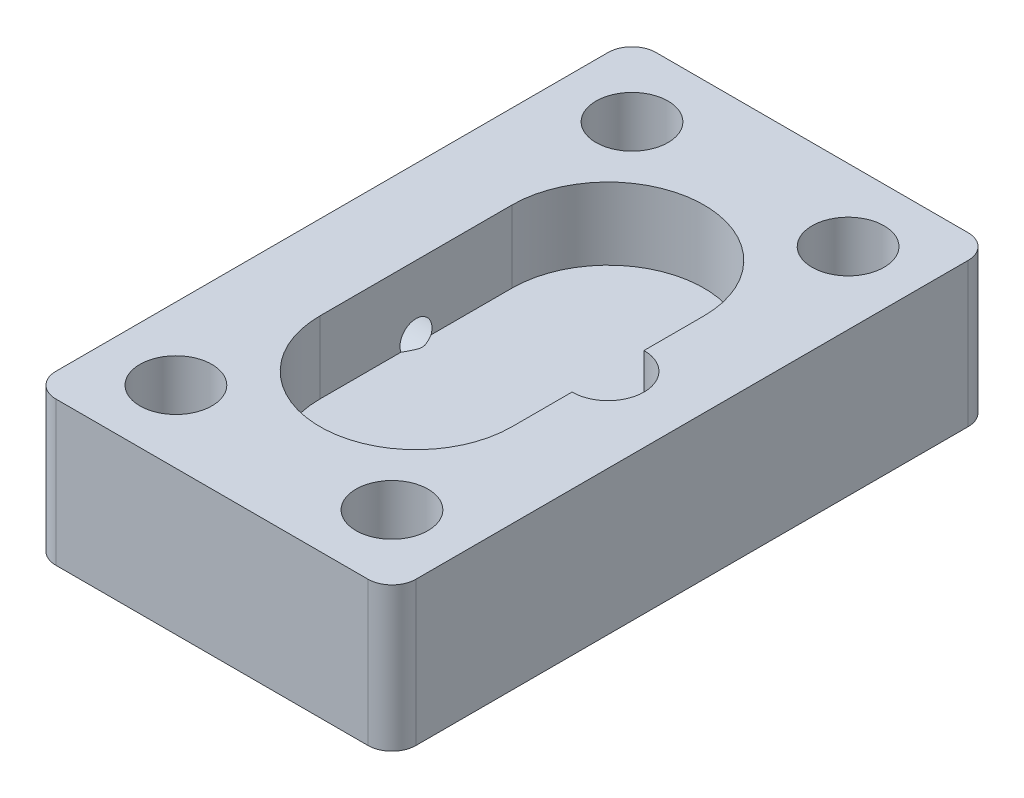
ISO-10303-21;
HEADER;
FILE_DESCRIPTION(('STEP AP214'),'2;1');
FILE_NAME('part.step','',(''),(''),'','','');
FILE_SCHEMA(('AUTOMOTIVE_DESIGN { 1 0 10303 214 1 1 1 1 }'));
ENDSEC;
DATA;
#1=APPLICATION_CONTEXT('core data for automotive mechanical design processes');
#2=APPLICATION_PROTOCOL_DEFINITION('international standard','automotive_design',2000,#1);
#3=PRODUCT_CONTEXT('',#1,'mechanical');
#4=PRODUCT('Part','Part','',(#3));
#5=PRODUCT_RELATED_PRODUCT_CATEGORY('part','',(#4));
#6=PRODUCT_DEFINITION_FORMATION('','',#4);
#7=PRODUCT_DEFINITION_CONTEXT('part definition',#1,'design');
#8=PRODUCT_DEFINITION('design','',#6,#7);
#9=PRODUCT_DEFINITION_SHAPE('','',#8);
#10=(LENGTH_UNIT() NAMED_UNIT(*) SI_UNIT(.MILLI.,.METRE.));
#11=(NAMED_UNIT(*) PLANE_ANGLE_UNIT() SI_UNIT($,.RADIAN.));
#12=(NAMED_UNIT(*) SI_UNIT($,.STERADIAN.) SOLID_ANGLE_UNIT());
#13=UNCERTAINTY_MEASURE_WITH_UNIT(LENGTH_MEASURE(1.E-05),#10,'distance_accuracy_value','');
#14=(GEOMETRIC_REPRESENTATION_CONTEXT(3) GLOBAL_UNCERTAINTY_ASSIGNED_CONTEXT((#13)) GLOBAL_UNIT_ASSIGNED_CONTEXT((#10,
#11,#12)) REPRESENTATION_CONTEXT('',''));
#15=CARTESIAN_POINT('',(0.,0.,0.));
#16=DIRECTION('',(0.,0.,1.));
#17=DIRECTION('',(1.,0.,0.));
#18=AXIS2_PLACEMENT_3D('',#15,#16,#17);
#19=CARTESIAN_POINT('',(-7.5,3.23052308593219,0.));
#20=DIRECTION('',(-1.,0.,0.));
#21=DIRECTION('',(0.,0.,1.));
#22=AXIS2_PLACEMENT_3D('',#19,#20,#21);
#23=CYLINDRICAL_SURFACE('',#22,1.5);
#24=CARTESIAN_POINT('',(-4.5,3.23052308593219,0.));
#25=DIRECTION('',(-1.,0.,0.));
#26=DIRECTION('',(0.,0.,1.));
#27=AXIS2_PLACEMENT_3D('',#24,#25,#26);
#28=CIRCLE('',#27,1.5);
#29=CARTESIAN_POINT('',(-4.5,3.23052308593219,1.5));
#30=VERTEX_POINT('',#29);
#31=EDGE_CURVE('E179',#30,#30,#28,.T.);
#32=ORIENTED_EDGE('',*,*,#31,.F.);
#33=EDGE_LOOP('',(#32));
#34=FACE_BOUND('',#33,.T.);
#35=CARTESIAN_POINT('',(-6.,3.23052308593219,0.));
#36=DIRECTION('',(-1.,0.,0.));
#37=DIRECTION('',(0.,0.,1.));
#38=AXIS2_PLACEMENT_3D('',#35,#36,#37);
#39=CIRCLE('',#38,1.5);
#40=CARTESIAN_POINT('',(-6.,3.23052308593219,1.5));
#41=VERTEX_POINT('',#40);
#42=EDGE_CURVE('E283',#41,#41,#39,.F.);
#43=ORIENTED_EDGE('',*,*,#42,.F.);
#44=EDGE_LOOP('',(#43));
#45=FACE_BOUND('',#44,.T.);
#46=ADVANCED_FACE('F43',(#34,#45),#23,.F.);
#47=CARTESIAN_POINT('',(7.5,6.,12.5));
#48=DIRECTION('',(-1.,0.,0.));
#49=DIRECTION('',(0.,0.,1.));
#50=AXIS2_PLACEMENT_3D('',#47,#48,#49);
#51=PLANE('',#50);
#52=DIRECTION('',(0.,0.,-1.));
#53=VECTOR('',#52,1.);
#54=CARTESIAN_POINT('',(7.5,6.,12.5));
#55=LINE('',#54,#53);
#56=CARTESIAN_POINT('',(7.5,6.,11.5));
#57=VERTEX_POINT('',#56);
#58=CARTESIAN_POINT('',(7.5,6.,-11.5));
#59=VERTEX_POINT('',#58);
#60=EDGE_CURVE('E250',#57,#59,#55,.T.);
#61=ORIENTED_EDGE('',*,*,#60,.F.);
#62=DIRECTION('',(0.,-1.,0.));
#63=VECTOR('',#62,1.);
#64=CARTESIAN_POINT('',(7.5,6.,11.5));
#65=LINE('',#64,#63);
#66=CARTESIAN_POINT('',(7.5,0.,11.5));
#67=VERTEX_POINT('',#66);
#68=EDGE_CURVE('E11',#57,#67,#65,.T.);
#69=ORIENTED_EDGE('',*,*,#68,.T.);
#70=DIRECTION('',(0.,0.,-1.));
#71=VECTOR('',#70,1.);
#72=CARTESIAN_POINT('',(7.5,0.,12.5));
#73=LINE('',#72,#71);
#74=CARTESIAN_POINT('',(7.5,0.,-11.5));
#75=VERTEX_POINT('',#74);
#76=EDGE_CURVE('E235',#67,#75,#73,.T.);
#77=ORIENTED_EDGE('',*,*,#76,.T.);
#78=DIRECTION('',(0.,-1.,0.));
#79=VECTOR('',#78,1.);
#80=CARTESIAN_POINT('',(7.5,6.,-11.5));
#81=LINE('',#80,#79);
#82=EDGE_CURVE('E52',#75,#59,#81,.F.);
#83=ORIENTED_EDGE('',*,*,#82,.T.);
#84=EDGE_LOOP('',(#61,#69,#77,#83));
#85=FACE_BOUND('',#84,.T.);
#86=ADVANCED_FACE('F334',(#85),#51,.F.);
#87=CARTESIAN_POINT('',(-7.5,6.,-12.5));
#88=DIRECTION('',(0.,0.,1.));
#89=DIRECTION('',(1.,0.,0.));
#90=AXIS2_PLACEMENT_3D('',#87,#88,#89);
#91=PLANE('',#90);
#92=DIRECTION('',(-1.,0.,0.));
#93=VECTOR('',#92,1.);
#94=CARTESIAN_POINT('',(-7.5,0.,-12.5));
#95=LINE('',#94,#93);
#96=CARTESIAN_POINT('',(6.5,0.,-12.5));
#97=VERTEX_POINT('',#96);
#98=CARTESIAN_POINT('',(-6.5,0.,-12.5));
#99=VERTEX_POINT('',#98);
#100=EDGE_CURVE('E267',#97,#99,#95,.T.);
#101=ORIENTED_EDGE('',*,*,#100,.T.);
#102=DIRECTION('',(0.,-1.,0.));
#103=VECTOR('',#102,1.);
#104=CARTESIAN_POINT('',(-6.5,6.,-12.5));
#105=LINE('',#104,#103);
#106=CARTESIAN_POINT('',(-6.5,6.,-12.5));
#107=VERTEX_POINT('',#106);
#108=EDGE_CURVE('E444',#99,#107,#105,.F.);
#109=ORIENTED_EDGE('',*,*,#108,.T.);
#110=DIRECTION('',(-1.,0.,0.));
#111=VECTOR('',#110,1.);
#112=CARTESIAN_POINT('',(-7.5,6.,-12.5));
#113=LINE('',#112,#111);
#114=CARTESIAN_POINT('',(6.5,6.,-12.5));
#115=VERTEX_POINT('',#114);
#116=EDGE_CURVE('E254',#115,#107,#113,.T.);
#117=ORIENTED_EDGE('',*,*,#116,.F.);
#118=DIRECTION('',(0.,-1.,0.));
#119=VECTOR('',#118,1.);
#120=CARTESIAN_POINT('',(6.5,6.,-12.5));
#121=LINE('',#120,#119);
#122=EDGE_CURVE('E464',#115,#97,#121,.T.);
#123=ORIENTED_EDGE('',*,*,#122,.T.);
#124=EDGE_LOOP('',(#101,#109,#117,#123));
#125=FACE_BOUND('',#124,.T.);
#126=ADVANCED_FACE('F330',(#125),#91,.F.);
#127=CARTESIAN_POINT('',(-7.5,6.,12.5));
#128=DIRECTION('',(1.,0.,0.));
#129=DIRECTION('',(0.,0.,-1.));
#130=AXIS2_PLACEMENT_3D('',#127,#128,#129);
#131=PLANE('',#130);
#132=CARTESIAN_POINT('',(-7.5,3.23052308593219,0.));
#133=DIRECTION('',(-1.,0.,0.));
#134=DIRECTION('',(0.,0.,1.));
#135=AXIS2_PLACEMENT_3D('',#132,#133,#134);
#136=CIRCLE('',#135,2.5);
#137=CARTESIAN_POINT('',(-7.5,3.23052308593219,2.5));
#138=VERTEX_POINT('',#137);
#139=EDGE_CURVE('E384',#138,#138,#136,.T.);
#140=ORIENTED_EDGE('',*,*,#139,.F.);
#141=EDGE_LOOP('',(#140));
#142=FACE_BOUND('',#141,.T.);
#143=DIRECTION('',(0.,0.,1.));
#144=VECTOR('',#143,1.);
#145=CARTESIAN_POINT('',(-7.5,6.,12.5));
#146=LINE('',#145,#144);
#147=CARTESIAN_POINT('',(-7.5,6.,-11.5));
#148=VERTEX_POINT('',#147);
#149=CARTESIAN_POINT('',(-7.5,6.,11.5));
#150=VERTEX_POINT('',#149);
#151=EDGE_CURVE('E259',#148,#150,#146,.T.);
#152=ORIENTED_EDGE('',*,*,#151,.F.);
#153=DIRECTION('',(0.,-1.,0.));
#154=VECTOR('',#153,1.);
#155=CARTESIAN_POINT('',(-7.5,6.,-11.5));
#156=LINE('',#155,#154);
#157=CARTESIAN_POINT('',(-7.5,0.,-11.5));
#158=VERTEX_POINT('',#157);
#159=EDGE_CURVE('E446',#148,#158,#156,.T.);
#160=ORIENTED_EDGE('',*,*,#159,.T.);
#161=DIRECTION('',(0.,0.,1.));
#162=VECTOR('',#161,1.);
#163=CARTESIAN_POINT('',(-7.5,0.,12.5));
#164=LINE('',#163,#162);
#165=CARTESIAN_POINT('',(-7.5,0.,11.5));
#166=VERTEX_POINT('',#165);
#167=EDGE_CURVE('E271',#158,#166,#164,.T.);
#168=ORIENTED_EDGE('',*,*,#167,.T.);
#169=DIRECTION('',(0.,-1.,0.));
#170=VECTOR('',#169,1.);
#171=CARTESIAN_POINT('',(-7.5,6.,11.5));
#172=LINE('',#171,#170);
#173=EDGE_CURVE('E166',#166,#150,#172,.F.);
#174=ORIENTED_EDGE('',*,*,#173,.T.);
#175=EDGE_LOOP('',(#152,#160,#168,#174));
#176=FACE_BOUND('',#175,.T.);
#177=ADVANCED_FACE('F327',(#142,#176),#131,.F.);
#178=CARTESIAN_POINT('',(-7.5,6.,12.5));
#179=DIRECTION('',(0.,0.,-1.));
#180=DIRECTION('',(-1.,0.,0.));
#181=AXIS2_PLACEMENT_3D('',#178,#179,#180);
#182=PLANE('',#181);
#183=DIRECTION('',(1.,0.,0.));
#184=VECTOR('',#183,1.);
#185=CARTESIAN_POINT('',(-7.5,6.,12.5));
#186=LINE('',#185,#184);
#187=CARTESIAN_POINT('',(-6.5,6.,12.5));
#188=VERTEX_POINT('',#187);
#189=CARTESIAN_POINT('',(6.5,6.,12.5));
#190=VERTEX_POINT('',#189);
#191=EDGE_CURVE('E167',#188,#190,#186,.T.);
#192=ORIENTED_EDGE('',*,*,#191,.F.);
#193=DIRECTION('',(0.,-1.,0.));
#194=VECTOR('',#193,1.);
#195=CARTESIAN_POINT('',(-6.5,6.,12.5));
#196=LINE('',#195,#194);
#197=CARTESIAN_POINT('',(-6.5,0.,12.5));
#198=VERTEX_POINT('',#197);
#199=EDGE_CURVE('E451',#188,#198,#196,.T.);
#200=ORIENTED_EDGE('',*,*,#199,.T.);
#201=DIRECTION('',(1.,0.,0.));
#202=VECTOR('',#201,1.);
#203=CARTESIAN_POINT('',(-7.5,0.,12.5));
#204=LINE('',#203,#202);
#205=CARTESIAN_POINT('',(6.5,0.,12.5));
#206=VERTEX_POINT('',#205);
#207=EDGE_CURVE('E255',#198,#206,#204,.T.);
#208=ORIENTED_EDGE('',*,*,#207,.T.);
#209=DIRECTION('',(0.,-1.,0.));
#210=VECTOR('',#209,1.);
#211=CARTESIAN_POINT('',(6.5,6.,12.5));
#212=LINE('',#211,#210);
#213=EDGE_CURVE('E59',#206,#190,#212,.F.);
#214=ORIENTED_EDGE('',*,*,#213,.T.);
#215=EDGE_LOOP('',(#192,#200,#208,#214));
#216=FACE_BOUND('',#215,.T.);
#217=ADVANCED_FACE('F320',(#216),#182,.F.);
#218=CARTESIAN_POINT('',(0.,6.,0.));
#219=DIRECTION('',(0.,-1.,0.));
#220=DIRECTION('',(0.,0.,-1.));
#221=AXIS2_PLACEMENT_3D('',#218,#219,#220);
#222=PLANE('',#221);
#223=CARTESIAN_POINT('',(4.5,6.,-9.5));
#224=DIRECTION('',(0.,1.,0.));
#225=DIRECTION('',(0.,0.,1.));
#226=AXIS2_PLACEMENT_3D('',#223,#224,#225);
#227=CIRCLE('',#226,1.5);
#228=CARTESIAN_POINT('',(4.5,6.,-8.));
#229=VERTEX_POINT('',#228);
#230=EDGE_CURVE('E407',#229,#229,#227,.T.);
#231=ORIENTED_EDGE('',*,*,#230,.F.);
#232=EDGE_LOOP('',(#231));
#233=FACE_BOUND('',#232,.T.);
#234=CARTESIAN_POINT('',(-4.5,6.,9.5));
#235=DIRECTION('',(0.,1.,0.));
#236=DIRECTION('',(0.,0.,1.));
#237=AXIS2_PLACEMENT_3D('',#234,#235,#236);
#238=CIRCLE('',#237,1.5);
#239=CARTESIAN_POINT('',(-4.5,6.,11.));
#240=VERTEX_POINT('',#239);
#241=EDGE_CURVE('E416',#240,#240,#238,.T.);
#242=ORIENTED_EDGE('',*,*,#241,.F.);
#243=EDGE_LOOP('',(#242));
#244=FACE_BOUND('',#243,.T.);
#245=CARTESIAN_POINT('',(4.5,6.,9.5));
#246=DIRECTION('',(0.,1.,0.));
#247=DIRECTION('',(0.,0.,1.));
#248=AXIS2_PLACEMENT_3D('',#245,#246,#247);
#249=CIRCLE('',#248,1.5);
#250=CARTESIAN_POINT('',(4.5,6.,11.));
#251=VERTEX_POINT('',#250);
#252=EDGE_CURVE('E399',#251,#251,#249,.T.);
#253=ORIENTED_EDGE('',*,*,#252,.F.);
#254=EDGE_LOOP('',(#253));
#255=FACE_BOUND('',#254,.T.);
#256=CARTESIAN_POINT('',(-4.5,6.,-9.5));
#257=DIRECTION('',(0.,1.,0.));
#258=DIRECTION('',(0.,0.,1.));
#259=AXIS2_PLACEMENT_3D('',#256,#257,#258);
#260=CIRCLE('',#259,1.5);
#261=CARTESIAN_POINT('',(-4.5,6.,-8.));
#262=VERTEX_POINT('',#261);
#263=EDGE_CURVE('E411',#262,#262,#260,.T.);
#264=ORIENTED_EDGE('',*,*,#263,.F.);
#265=EDGE_LOOP('',(#264));
#266=FACE_BOUND('',#265,.T.);
#267=DIRECTION('',(0.,0.,1.));
#268=VECTOR('',#267,1.);
#269=CARTESIAN_POINT('',(-4.,6.,-4.));
#270=LINE('',#269,#268);
#271=CARTESIAN_POINT('',(-4.,6.,-4.));
#272=VERTEX_POINT('',#271);
#273=CARTESIAN_POINT('',(-4.,6.,4.));
#274=VERTEX_POINT('',#273);
#275=EDGE_CURVE('E211',#272,#274,#270,.T.);
#276=ORIENTED_EDGE('',*,*,#275,.F.);
#277=CARTESIAN_POINT('',(0.,6.,-4.));
#278=DIRECTION('',(0.,1.,0.));
#279=DIRECTION('',(0.,0.,1.));
#280=AXIS2_PLACEMENT_3D('',#277,#278,#279);
#281=CIRCLE('',#280,4.);
#282=CARTESIAN_POINT('',(4.,6.,-4.));
#283=VERTEX_POINT('',#282);
#284=EDGE_CURVE('E208',#283,#272,#281,.T.);
#285=ORIENTED_EDGE('',*,*,#284,.F.);
#286=DIRECTION('',(0.,0.,-1.));
#287=VECTOR('',#286,1.);
#288=CARTESIAN_POINT('',(4.,6.,-4.));
#289=LINE('',#288,#287);
#290=CARTESIAN_POINT('',(4.,6.,-1.5));
#291=VERTEX_POINT('',#290);
#292=EDGE_CURVE('E228',#291,#283,#289,.T.);
#293=ORIENTED_EDGE('',*,*,#292,.F.);
#294=CARTESIAN_POINT('',(4.,6.,0.));
#295=DIRECTION('',(0.,1.,0.));
#296=DIRECTION('',(0.,0.,1.));
#297=AXIS2_PLACEMENT_3D('',#294,#295,#296);
#298=CIRCLE('',#297,1.5);
#299=CARTESIAN_POINT('',(4.,6.,1.5));
#300=VERTEX_POINT('',#299);
#301=EDGE_CURVE('E224',#300,#291,#298,.T.);
#302=ORIENTED_EDGE('',*,*,#301,.F.);
#303=DIRECTION('',(0.,0.,-1.));
#304=VECTOR('',#303,1.);
#305=CARTESIAN_POINT('',(4.,6.,1.5));
#306=LINE('',#305,#304);
#307=CARTESIAN_POINT('',(4.,6.,4.));
#308=VERTEX_POINT('',#307);
#309=EDGE_CURVE('E220',#308,#300,#306,.T.);
#310=ORIENTED_EDGE('',*,*,#309,.F.);
#311=CARTESIAN_POINT('',(0.,6.,4.));
#312=DIRECTION('',(0.,1.,0.));
#313=DIRECTION('',(0.,0.,1.));
#314=AXIS2_PLACEMENT_3D('',#311,#312,#313);
#315=CIRCLE('',#314,4.);
#316=EDGE_CURVE('E216',#274,#308,#315,.T.);
#317=ORIENTED_EDGE('',*,*,#316,.F.);
#318=EDGE_LOOP('',(#276,#285,#293,#302,#310,#317));
#319=FACE_BOUND('',#318,.T.);
#320=ORIENTED_EDGE('',*,*,#116,.T.);
#321=CARTESIAN_POINT('',(-6.5,6.,-11.5));
#322=DIRECTION('',(0.,-1.,0.));
#323=DIRECTION('',(0.,0.,-1.));
#324=AXIS2_PLACEMENT_3D('',#321,#322,#323);
#325=CIRCLE('',#324,1.);
#326=EDGE_CURVE('E436',#107,#148,#325,.F.);
#327=ORIENTED_EDGE('',*,*,#326,.T.);
#328=ORIENTED_EDGE('',*,*,#151,.T.);
#329=CARTESIAN_POINT('',(-6.5,6.,11.5));
#330=DIRECTION('',(0.,-1.,0.));
#331=DIRECTION('',(0.,0.,-1.));
#332=AXIS2_PLACEMENT_3D('',#329,#330,#331);
#333=CIRCLE('',#332,1.);
#334=EDGE_CURVE('E66',#150,#188,#333,.F.);
#335=ORIENTED_EDGE('',*,*,#334,.T.);
#336=ORIENTED_EDGE('',*,*,#191,.T.);
#337=CARTESIAN_POINT('',(6.5,6.,11.5));
#338=DIRECTION('',(0.,-1.,0.));
#339=DIRECTION('',(0.,0.,-1.));
#340=AXIS2_PLACEMENT_3D('',#337,#338,#339);
#341=CIRCLE('',#340,1.);
#342=EDGE_CURVE('E453',#190,#57,#341,.F.);
#343=ORIENTED_EDGE('',*,*,#342,.T.);
#344=ORIENTED_EDGE('',*,*,#60,.T.);
#345=CARTESIAN_POINT('',(6.5,6.,-11.5));
#346=DIRECTION('',(0.,-1.,0.));
#347=DIRECTION('',(0.,0.,-1.));
#348=AXIS2_PLACEMENT_3D('',#345,#346,#347);
#349=CIRCLE('',#348,1.);
#350=EDGE_CURVE('E439',#59,#115,#349,.F.);
#351=ORIENTED_EDGE('',*,*,#350,.T.);
#352=EDGE_LOOP('',(#320,#327,#328,#335,#336,#343,#344,#351));
#353=FACE_BOUND('',#352,.T.);
#354=ADVANCED_FACE('F317',(#233,#244,#255,#266,#319,#353),#222,.F.);
#355=CARTESIAN_POINT('',(0.,0.,0.));
#356=DIRECTION('',(0.,-1.,0.));
#357=DIRECTION('',(0.,0.,-1.));
#358=AXIS2_PLACEMENT_3D('',#355,#356,#357);
#359=PLANE('',#358);
#360=CARTESIAN_POINT('',(4.,0.,0.));
#361=DIRECTION('',(0.,-1.,0.));
#362=DIRECTION('',(0.,0.,-1.));
#363=AXIS2_PLACEMENT_3D('',#360,#361,#362);
#364=CIRCLE('',#363,2.5);
#365=CARTESIAN_POINT('',(4.,0.,-2.5));
#366=VERTEX_POINT('',#365);
#367=EDGE_CURVE('E178',#366,#366,#364,.T.);
#368=ORIENTED_EDGE('',*,*,#367,.F.);
#369=EDGE_LOOP('',(#368));
#370=FACE_BOUND('',#369,.T.);
#371=CARTESIAN_POINT('',(4.5,0.,-9.5));
#372=DIRECTION('',(0.,1.,0.));
#373=DIRECTION('',(0.,0.,1.));
#374=AXIS2_PLACEMENT_3D('',#371,#372,#373);
#375=CIRCLE('',#374,1.5);
#376=CARTESIAN_POINT('',(4.5,0.,-8.));
#377=VERTEX_POINT('',#376);
#378=EDGE_CURVE('E412',#377,#377,#375,.T.);
#379=ORIENTED_EDGE('',*,*,#378,.T.);
#380=EDGE_LOOP('',(#379));
#381=FACE_BOUND('',#380,.T.);
#382=CARTESIAN_POINT('',(-4.5,0.,9.5));
#383=DIRECTION('',(0.,1.,0.));
#384=DIRECTION('',(0.,0.,1.));
#385=AXIS2_PLACEMENT_3D('',#382,#383,#384);
#386=CIRCLE('',#385,1.5);
#387=CARTESIAN_POINT('',(-4.5,0.,11.));
#388=VERTEX_POINT('',#387);
#389=EDGE_CURVE('E403',#388,#388,#386,.T.);
#390=ORIENTED_EDGE('',*,*,#389,.T.);
#391=EDGE_LOOP('',(#390));
#392=FACE_BOUND('',#391,.T.);
#393=CARTESIAN_POINT('',(4.5,0.,9.5));
#394=DIRECTION('',(0.,1.,0.));
#395=DIRECTION('',(0.,0.,1.));
#396=AXIS2_PLACEMENT_3D('',#393,#394,#395);
#397=CIRCLE('',#396,1.5);
#398=CARTESIAN_POINT('',(4.5,0.,11.));
#399=VERTEX_POINT('',#398);
#400=EDGE_CURVE('E394',#399,#399,#397,.T.);
#401=ORIENTED_EDGE('',*,*,#400,.T.);
#402=EDGE_LOOP('',(#401));
#403=FACE_BOUND('',#402,.T.);
#404=CARTESIAN_POINT('',(-4.5,0.,-9.5));
#405=DIRECTION('',(0.,1.,0.));
#406=DIRECTION('',(0.,0.,1.));
#407=AXIS2_PLACEMENT_3D('',#404,#405,#406);
#408=CIRCLE('',#407,1.5);
#409=CARTESIAN_POINT('',(-4.5,0.,-8.));
#410=VERTEX_POINT('',#409);
#411=EDGE_CURVE('E212',#410,#410,#408,.T.);
#412=ORIENTED_EDGE('',*,*,#411,.T.);
#413=EDGE_LOOP('',(#412));
#414=FACE_BOUND('',#413,.T.);
#415=ORIENTED_EDGE('',*,*,#167,.F.);
#416=CARTESIAN_POINT('',(-6.5,0.,-11.5));
#417=DIRECTION('',(0.,-1.,0.));
#418=DIRECTION('',(0.,0.,-1.));
#419=AXIS2_PLACEMENT_3D('',#416,#417,#418);
#420=CIRCLE('',#419,1.);
#421=EDGE_CURVE('E473',#158,#99,#420,.T.);
#422=ORIENTED_EDGE('',*,*,#421,.T.);
#423=ORIENTED_EDGE('',*,*,#100,.F.);
#424=CARTESIAN_POINT('',(6.5,0.,-11.5));
#425=DIRECTION('',(0.,-1.,0.));
#426=DIRECTION('',(0.,0.,-1.));
#427=AXIS2_PLACEMENT_3D('',#424,#425,#426);
#428=CIRCLE('',#427,1.);
#429=EDGE_CURVE('E482',#97,#75,#428,.T.);
#430=ORIENTED_EDGE('',*,*,#429,.T.);
#431=ORIENTED_EDGE('',*,*,#76,.F.);
#432=CARTESIAN_POINT('',(6.5,0.,11.5));
#433=DIRECTION('',(0.,-1.,0.));
#434=DIRECTION('',(0.,0.,-1.));
#435=AXIS2_PLACEMENT_3D('',#432,#433,#434);
#436=CIRCLE('',#435,1.);
#437=EDGE_CURVE('E479',#67,#206,#436,.T.);
#438=ORIENTED_EDGE('',*,*,#437,.T.);
#439=ORIENTED_EDGE('',*,*,#207,.F.);
#440=CARTESIAN_POINT('',(-6.5,0.,11.5));
#441=DIRECTION('',(0.,-1.,0.));
#442=DIRECTION('',(0.,0.,-1.));
#443=AXIS2_PLACEMENT_3D('',#440,#441,#442);
#444=CIRCLE('',#443,1.);
#445=EDGE_CURVE('E476',#198,#166,#444,.T.);
#446=ORIENTED_EDGE('',*,*,#445,.T.);
#447=EDGE_LOOP('',(#415,#422,#423,#430,#431,#438,#439,#446));
#448=FACE_BOUND('',#447,.T.);
#449=ADVANCED_FACE('F315',(#370,#381,#392,#403,#414,#448),#359,.T.);
#450=CARTESIAN_POINT('',(0.,3.,-4.));
#451=DIRECTION('',(0.,1.,0.));
#452=DIRECTION('',(0.,0.,1.));
#453=AXIS2_PLACEMENT_3D('',#450,#451,#452);
#454=CYLINDRICAL_SURFACE('',#453,4.);
#455=ORIENTED_EDGE('',*,*,#284,.T.);
#456=DIRECTION('',(0.,1.,0.));
#457=VECTOR('',#456,1.);
#458=CARTESIAN_POINT('',(-4.,3.,-4.));
#459=LINE('',#458,#457);
#460=CARTESIAN_POINT('',(-4.,3.,-4.));
#461=VERTEX_POINT('',#460);
#462=EDGE_CURVE('E207',#461,#272,#459,.T.);
#463=ORIENTED_EDGE('',*,*,#462,.F.);
#464=CARTESIAN_POINT('',(0.,3.,-4.));
#465=DIRECTION('',(0.,1.,0.));
#466=DIRECTION('',(0.,0.,1.));
#467=AXIS2_PLACEMENT_3D('',#464,#465,#466);
#468=CIRCLE('',#467,4.);
#469=CARTESIAN_POINT('',(4.,3.,-4.));
#470=VERTEX_POINT('',#469);
#471=EDGE_CURVE('E183',#470,#461,#468,.T.);
#472=ORIENTED_EDGE('',*,*,#471,.F.);
#473=DIRECTION('',(0.,1.,0.));
#474=VECTOR('',#473,1.);
#475=CARTESIAN_POINT('',(4.,3.,-4.));
#476=LINE('',#475,#474);
#477=EDGE_CURVE('E232',#470,#283,#476,.T.);
#478=ORIENTED_EDGE('',*,*,#477,.T.);
#479=EDGE_LOOP('',(#455,#463,#472,#478));
#480=FACE_BOUND('',#479,.T.);
#481=ADVANCED_FACE('F298',(#480),#454,.F.);
#482=CARTESIAN_POINT('',(4.,3.,-4.));
#483=DIRECTION('',(1.,0.,0.));
#484=DIRECTION('',(0.,0.,-1.));
#485=AXIS2_PLACEMENT_3D('',#482,#483,#484);
#486=PLANE('',#485);
#487=ORIENTED_EDGE('',*,*,#292,.T.);
#488=ORIENTED_EDGE('',*,*,#477,.F.);
#489=DIRECTION('',(0.,0.,-1.));
#490=VECTOR('',#489,1.);
#491=CARTESIAN_POINT('',(4.,3.,-4.));
#492=LINE('',#491,#490);
#493=CARTESIAN_POINT('',(4.,3.,-2.5));
#494=VERTEX_POINT('',#493);
#495=EDGE_CURVE('E202',#494,#470,#492,.T.);
#496=ORIENTED_EDGE('',*,*,#495,.F.);
#497=CARTESIAN_POINT('',(4.,3.,-1.5));
#498=VERTEX_POINT('',#497);
#499=EDGE_CURVE('E203',#498,#494,#492,.T.);
#500=ORIENTED_EDGE('',*,*,#499,.F.);
#501=DIRECTION('',(0.,1.,0.));
#502=VECTOR('',#501,1.);
#503=CARTESIAN_POINT('',(4.,3.,-1.5));
#504=LINE('',#503,#502);
#505=EDGE_CURVE('E236',#498,#291,#504,.T.);
#506=ORIENTED_EDGE('',*,*,#505,.T.);
#507=EDGE_LOOP('',(#487,#488,#496,#500,#506));
#508=FACE_BOUND('',#507,.T.);
#509=ADVANCED_FACE('F294',(#508),#486,.F.);
#510=CARTESIAN_POINT('',(4.,3.,0.));
#511=DIRECTION('',(0.,1.,0.));
#512=DIRECTION('',(0.,0.,1.));
#513=AXIS2_PLACEMENT_3D('',#510,#511,#512);
#514=CYLINDRICAL_SURFACE('',#513,1.5);
#515=ORIENTED_EDGE('',*,*,#301,.T.);
#516=ORIENTED_EDGE('',*,*,#505,.F.);
#517=CARTESIAN_POINT('',(4.,3.,0.));
#518=DIRECTION('',(0.,1.,0.));
#519=DIRECTION('',(0.,0.,1.));
#520=AXIS2_PLACEMENT_3D('',#517,#518,#519);
#521=CIRCLE('',#520,1.5);
#522=CARTESIAN_POINT('',(4.,3.,1.5));
#523=VERTEX_POINT('',#522);
#524=EDGE_CURVE('E199',#523,#498,#521,.T.);
#525=ORIENTED_EDGE('',*,*,#524,.F.);
#526=DIRECTION('',(0.,1.,0.));
#527=VECTOR('',#526,1.);
#528=CARTESIAN_POINT('',(4.,3.,1.5));
#529=LINE('',#528,#527);
#530=EDGE_CURVE('E239',#523,#300,#529,.T.);
#531=ORIENTED_EDGE('',*,*,#530,.T.);
#532=EDGE_LOOP('',(#515,#516,#525,#531));
#533=FACE_BOUND('',#532,.T.);
#534=ADVANCED_FACE('F297',(#533),#514,.F.);
#535=CARTESIAN_POINT('',(4.,3.,1.5));
#536=DIRECTION('',(1.,0.,0.));
#537=DIRECTION('',(0.,0.,-1.));
#538=AXIS2_PLACEMENT_3D('',#535,#536,#537);
#539=PLANE('',#538);
#540=ORIENTED_EDGE('',*,*,#309,.T.);
#541=ORIENTED_EDGE('',*,*,#530,.F.);
#542=DIRECTION('',(0.,0.,-1.));
#543=VECTOR('',#542,1.);
#544=CARTESIAN_POINT('',(4.,3.,1.5));
#545=LINE('',#544,#543);
#546=CARTESIAN_POINT('',(4.,3.,2.5));
#547=VERTEX_POINT('',#546);
#548=EDGE_CURVE('E190',#547,#523,#545,.T.);
#549=ORIENTED_EDGE('',*,*,#548,.F.);
#550=CARTESIAN_POINT('',(4.,3.,4.));
#551=VERTEX_POINT('',#550);
#552=EDGE_CURVE('E195',#551,#547,#545,.T.);
#553=ORIENTED_EDGE('',*,*,#552,.F.);
#554=DIRECTION('',(0.,1.,0.));
#555=VECTOR('',#554,1.);
#556=CARTESIAN_POINT('',(4.,3.,4.));
#557=LINE('',#556,#555);
#558=EDGE_CURVE('E242',#551,#308,#557,.T.);
#559=ORIENTED_EDGE('',*,*,#558,.T.);
#560=EDGE_LOOP('',(#540,#541,#549,#553,#559));
#561=FACE_BOUND('',#560,.T.);
#562=ADVANCED_FACE('F302',(#561),#539,.F.);
#563=CARTESIAN_POINT('',(0.,3.,4.));
#564=DIRECTION('',(0.,1.,0.));
#565=DIRECTION('',(0.,0.,1.));
#566=AXIS2_PLACEMENT_3D('',#563,#564,#565);
#567=CYLINDRICAL_SURFACE('',#566,4.);
#568=ORIENTED_EDGE('',*,*,#316,.T.);
#569=ORIENTED_EDGE('',*,*,#558,.F.);
#570=CARTESIAN_POINT('',(0.,3.,4.));
#571=DIRECTION('',(0.,1.,0.));
#572=DIRECTION('',(0.,0.,1.));
#573=AXIS2_PLACEMENT_3D('',#570,#571,#572);
#574=CIRCLE('',#573,4.);
#575=CARTESIAN_POINT('',(-4.,3.,4.));
#576=VERTEX_POINT('',#575);
#577=EDGE_CURVE('E185',#576,#551,#574,.T.);
#578=ORIENTED_EDGE('',*,*,#577,.F.);
#579=DIRECTION('',(0.,1.,0.));
#580=VECTOR('',#579,1.);
#581=CARTESIAN_POINT('',(-4.,3.,4.));
#582=LINE('',#581,#580);
#583=EDGE_CURVE('E245',#576,#274,#582,.T.);
#584=ORIENTED_EDGE('',*,*,#583,.T.);
#585=EDGE_LOOP('',(#568,#569,#578,#584));
#586=FACE_BOUND('',#585,.T.);
#587=ADVANCED_FACE('F306',(#586),#567,.F.);
#588=CARTESIAN_POINT('',(-4.,3.,-4.));
#589=DIRECTION('',(-1.,0.,0.));
#590=DIRECTION('',(0.,0.,1.));
#591=AXIS2_PLACEMENT_3D('',#588,#589,#590);
#592=PLANE('',#591);
#593=DIRECTION('',(0.,0.,1.));
#594=VECTOR('',#593,1.);
#595=CARTESIAN_POINT('',(-4.,3.,-4.));
#596=LINE('',#595,#594);
#597=CARTESIAN_POINT('',(-4.,3.,0.626814511773427));
#598=VERTEX_POINT('',#597);
#599=EDGE_CURVE('E176',#598,#576,#596,.T.);
#600=ORIENTED_EDGE('',*,*,#599,.F.);
#601=CARTESIAN_POINT('',(-4.,3.23052308593219,0.));
#602=DIRECTION('',(-1.,0.,0.));
#603=DIRECTION('',(0.,0.,1.));
#604=AXIS2_PLACEMENT_3D('',#601,#602,#603);
#605=CIRCLE('',#604,0.667860258824748);
#606=CARTESIAN_POINT('',(-4.,3.,-0.626814511773427));
#607=VERTEX_POINT('',#606);
#608=EDGE_CURVE('E161',#598,#607,#605,.T.);
#609=ORIENTED_EDGE('',*,*,#608,.T.);
#610=EDGE_CURVE('E173',#461,#607,#596,.T.);
#611=ORIENTED_EDGE('',*,*,#610,.F.);
#612=ORIENTED_EDGE('',*,*,#462,.T.);
#613=ORIENTED_EDGE('',*,*,#275,.T.);
#614=ORIENTED_EDGE('',*,*,#583,.F.);
#615=EDGE_LOOP('',(#600,#609,#611,#612,#613,#614));
#616=FACE_BOUND('',#615,.T.);
#617=ADVANCED_FACE('F171',(#616),#592,.F.);
#618=CARTESIAN_POINT('',(0.,3.,-4.));
#619=DIRECTION('',(0.,1.,0.));
#620=DIRECTION('',(0.,0.,1.));
#621=AXIS2_PLACEMENT_3D('',#618,#619,#620);
#622=PLANE('',#621);
#623=CARTESIAN_POINT('',(-5.77094392424502,3.,-3.60784877451603));
#624=CARTESIAN_POINT('',(-5.69589687088796,3.,-3.48269276096139));
#625=CARTESIAN_POINT('',(-5.62085978668349,3.,-3.35753076741102));
#626=CARTESIAN_POINT('',(-5.47081757346073,3.,-3.10718551199456));
#627=CARTESIAN_POINT('',(-5.39581244485168,3.,-2.98200224988319));
#628=CARTESIAN_POINT('',(-5.24582250870694,3.,-2.73156565403201));
#629=CARTESIAN_POINT('',(-5.17083771677512,3.,-2.60631231094413));
#630=CARTESIAN_POINT('',(-5.02093937476042,3.,-2.35576506999105));
#631=CARTESIAN_POINT('',(-4.94602582382675,3.,-2.23047117263475));
#632=CARTESIAN_POINT('',(-4.79681394927132,3.,-1.98065868705581));
#633=CARTESIAN_POINT('',(-4.72251487477111,3.,-1.85614054792513));
#634=CARTESIAN_POINT('',(-4.57411531525241,3.,-1.60698018343486));
#635=CARTESIAN_POINT('',(-4.50001483733989,3.,-1.48233795384841));
#636=CARTESIAN_POINT('',(-4.35220871647999,3.,-1.23285553692479));
#637=CARTESIAN_POINT('',(-4.27850299004159,3.,-1.10801539932027));
#638=CARTESIAN_POINT('',(-4.16871106351143,3.,-0.920311365495565));
#639=CARTESIAN_POINT('',(-4.13224257436271,3.,-0.857671199078284));
#640=CARTESIAN_POINT('',(-4.05977649851367,3.,-0.73211947623883));
#641=CARTESIAN_POINT('',(-4.02377889818324,3.,-0.669207927742346));
#642=CARTESIAN_POINT('',(-3.97343765234729,3.,-0.579557310311079));
#643=CARTESIAN_POINT('',(-3.95867347279799,3.,-0.553055040632593));
#644=CARTESIAN_POINT('',(-3.92941423568301,3.,-0.499898539722782));
#645=CARTESIAN_POINT('',(-3.91491920690606,3.,-0.473244292629758));
#646=CARTESIAN_POINT('',(-3.88629164819752,3.,-0.419627420286863));
#647=CARTESIAN_POINT('',(-3.87216045858438,3.,-0.392664071665296));
#648=CARTESIAN_POINT('',(-3.84458165412383,3.,-0.338397698839999));
#649=CARTESIAN_POINT('',(-3.83113390088042,3.,-0.311094744811551));
#650=CARTESIAN_POINT('',(-3.80395681031864,3.,-0.252840557809842));
#651=CARTESIAN_POINT('',(-3.79036391875481,3.,-0.221822569394423));
#652=CARTESIAN_POINT('',(-3.77226660830924,3.,-0.174455980748464));
#653=CARTESIAN_POINT('',(-3.76662321410582,3.,-0.158552683820755));
#654=CARTESIAN_POINT('',(-3.75645942048802,3.,-0.126397981686055));
#655=CARTESIAN_POINT('',(-3.75193844839353,3.,-0.110146758614023));
#656=CARTESIAN_POINT('',(-3.74283550797287,3.,-0.069815955707875));
#657=CARTESIAN_POINT('',(-3.73914390467958,3.,-0.0455084198508499));
#658=CARTESIAN_POINT('',(-3.7371291829709,3.,-0.00890734815534419));
#659=CARTESIAN_POINT('',(-3.73704211729173,3.,0.00329707633705771));
#660=CARTESIAN_POINT('',(-3.73802434688607,3.,0.0276613468212896));
#661=CARTESIAN_POINT('',(-3.73909387318181,3.,0.0398211834200817));
#662=CARTESIAN_POINT('',(-3.74518288586755,3.,0.0859469794639172));
#663=CARTESIAN_POINT('',(-3.75384832623848,3.,0.119421585226019));
#664=CARTESIAN_POINT('',(-3.77010565635585,3.,0.168583887689005));
#665=CARTESIAN_POINT('',(-3.77611971617309,3.,0.184902597445005));
#666=CARTESIAN_POINT('',(-3.78889930243806,3.,0.217246830572443));
#667=CARTESIAN_POINT('',(-3.79566447867549,3.,0.23327248655531));
#668=CARTESIAN_POINT('',(-3.81895085937799,3.,0.286104868079133));
#669=CARTESIAN_POINT('',(-3.83656214150634,3.,0.322418874185595));
#670=CARTESIAN_POINT('',(-3.87298445000513,3.,0.394445194563416));
#671=CARTESIAN_POINT('',(-3.89179610871499,3.,0.43015717896666));
#672=CARTESIAN_POINT('',(-3.9300960669005,3.,0.501282301584777));
#673=CARTESIAN_POINT('',(-3.9495852995277,3.,0.536694936830028));
#674=CARTESIAN_POINT('',(-3.9889368091564,3.,0.607299015861636));
#675=CARTESIAN_POINT('',(-4.00879899008447,3.,0.642490513579259));
#676=CARTESIAN_POINT('',(-4.06848469346493,3.,0.74742672348903));
#677=CARTESIAN_POINT('',(-4.10865151519076,3.,0.816975896796609));
#678=CARTESIAN_POINT('',(-4.18937354453536,3.,0.955769288500232));
#679=CARTESIAN_POINT('',(-4.22992840043856,3.,1.02501371279667));
#680=CARTESIAN_POINT('',(-4.35145580133997,3.,1.23172797881003));
#681=CARTESIAN_POINT('',(-4.43276620019988,3.,1.36899914700113));
#682=CARTESIAN_POINT('',(-4.59572581420833,3.,1.64334163839273));
#683=CARTESIAN_POINT('',(-4.67737503356452,3.,1.78041295908267));
#684=CARTESIAN_POINT('',(-4.8408855670693,3.,2.05450270789328));
#685=CARTESIAN_POINT('',(-4.92274695236342,3.,2.19152109361741));
#686=CARTESIAN_POINT('',(-5.08656948963538,3.,2.4654973470628));
#687=CARTESIAN_POINT('',(-5.16853064118283,3.,2.60245521504167));
#688=CARTESIAN_POINT('',(-5.41605806980945,3.,3.01587224428222));
#689=CARTESIAN_POINT('',(-5.5817157812954,3.,3.29227666012625));
#690=CARTESIAN_POINT('',(-5.91308654212168,3.,3.84489586688448));
#691=CARTESIAN_POINT('',(-6.07879953969783,3.,4.12111068883339));
#692=CARTESIAN_POINT('',(-6.24451574384329,3.,4.39732349145432));
#693=B_SPLINE_CURVE_WITH_KNOTS('',3,(#623,#624,#625,#626,#627,#628,#629,#630,#631,#632,#633,
#634,#635,#636,#637,#638,#639,#640,#641,#642,#643,#644,#645,#646,#647,#648,#649,#650,#651,#652,
#653,#654,#655,#656,#657,#658,#659,#660,#661,#662,#663,#664,#665,#666,#667,#668,#669,#670,#671,
#672,#673,#674,#675,#676,#677,#678,#679,#680,#681,#682,#683,#684,#685,#686,#687,#688,#689,#690,
#691,#692),.UNSPECIFIED.,.F.,.F.,(4,2,2,2,2,2,2,2,2,2,2,2,2,2,2,2,2,2,2,2,2,2,2,2,2,2,2,2,2,2,2,
2,2,2,4),(0.,0.437795377783684,0.875596203160407,1.31354602879789,1.75149055688888,
2.18649156892435,2.62150794326841,3.05642835722947,3.27387600038452,3.49131733542462,
3.58232803472825,3.67334841322898,3.76466641908059,3.85596585872692,3.95746721945239,
4.00806004535091,4.05862700457691,4.13197830329557,4.16853958202992,4.2051081650072,
4.30806874308909,4.36025647533437,4.41241997627339,4.53344082083722,4.65452595215822,
4.77578501751664,4.89701326318947,5.13795311539706,5.37869209601201,5.85732629786204,
6.33596646153668,6.81479603653257,7.2936235531501,8.26035866196742,9.22669123090309),.UNSPECIFIED.);
#694=EDGE_CURVE('E158',#598,#607,#693,.F.);
#695=ORIENTED_EDGE('',*,*,#694,.F.);
#696=ORIENTED_EDGE('',*,*,#599,.T.);
#697=ORIENTED_EDGE('',*,*,#577,.T.);
#698=ORIENTED_EDGE('',*,*,#552,.T.);
#699=CARTESIAN_POINT('',(4.,3.,0.));
#700=DIRECTION('',(0.,-1.,0.));
#701=DIRECTION('',(0.,0.,-1.));
#702=AXIS2_PLACEMENT_3D('',#699,#700,#701);
#703=CIRCLE('',#702,2.5);
#704=EDGE_CURVE('E395',#547,#494,#703,.T.);
#705=ORIENTED_EDGE('',*,*,#704,.T.);
#706=ORIENTED_EDGE('',*,*,#495,.T.);
#707=ORIENTED_EDGE('',*,*,#471,.T.);
#708=ORIENTED_EDGE('',*,*,#610,.T.);
#709=EDGE_LOOP('',(#695,#696,#697,#698,#705,#706,#707,#708));
#710=FACE_BOUND('',#709,.T.);
#711=ADVANCED_FACE('F181',(#710),#622,.T.);
#712=CARTESIAN_POINT('',(-4.5,0.,-9.5));
#713=DIRECTION('',(0.,1.,0.));
#714=DIRECTION('',(0.,0.,1.));
#715=AXIS2_PLACEMENT_3D('',#712,#713,#714);
#716=CYLINDRICAL_SURFACE('',#715,1.5);
#717=ORIENTED_EDGE('',*,*,#411,.F.);
#718=EDGE_LOOP('',(#717));
#719=FACE_BOUND('',#718,.T.);
#720=ORIENTED_EDGE('',*,*,#263,.T.);
#721=EDGE_LOOP('',(#720));
#722=FACE_BOUND('',#721,.T.);
#723=ADVANCED_FACE('F292',(#719,#722),#716,.F.);
#724=CARTESIAN_POINT('',(4.5,0.,9.5));
#725=DIRECTION('',(0.,1.,0.));
#726=DIRECTION('',(0.,0.,1.));
#727=AXIS2_PLACEMENT_3D('',#724,#725,#726);
#728=CYLINDRICAL_SURFACE('',#727,1.5);
#729=ORIENTED_EDGE('',*,*,#400,.F.);
#730=EDGE_LOOP('',(#729));
#731=FACE_BOUND('',#730,.T.);
#732=ORIENTED_EDGE('',*,*,#252,.T.);
#733=EDGE_LOOP('',(#732));
#734=FACE_BOUND('',#733,.T.);
#735=ADVANCED_FACE('F526',(#731,#734),#728,.F.);
#736=CARTESIAN_POINT('',(-4.5,0.,9.5));
#737=DIRECTION('',(0.,1.,0.));
#738=DIRECTION('',(0.,0.,1.));
#739=AXIS2_PLACEMENT_3D('',#736,#737,#738);
#740=CYLINDRICAL_SURFACE('',#739,1.5);
#741=ORIENTED_EDGE('',*,*,#389,.F.);
#742=EDGE_LOOP('',(#741));
#743=FACE_BOUND('',#742,.T.);
#744=ORIENTED_EDGE('',*,*,#241,.T.);
#745=EDGE_LOOP('',(#744));
#746=FACE_BOUND('',#745,.T.);
#747=ADVANCED_FACE('F530',(#743,#746),#740,.F.);
#748=CARTESIAN_POINT('',(4.5,0.,-9.5));
#749=DIRECTION('',(0.,1.,0.));
#750=DIRECTION('',(0.,0.,1.));
#751=AXIS2_PLACEMENT_3D('',#748,#749,#750);
#752=CYLINDRICAL_SURFACE('',#751,1.5);
#753=ORIENTED_EDGE('',*,*,#378,.F.);
#754=EDGE_LOOP('',(#753));
#755=FACE_BOUND('',#754,.T.);
#756=ORIENTED_EDGE('',*,*,#230,.T.);
#757=EDGE_LOOP('',(#756));
#758=FACE_BOUND('',#757,.T.);
#759=ADVANCED_FACE('F536',(#755,#758),#752,.F.);
#760=CARTESIAN_POINT('',(4.,3.,0.));
#761=DIRECTION('',(0.,-1.,0.));
#762=DIRECTION('',(0.,0.,-1.));
#763=AXIS2_PLACEMENT_3D('',#760,#761,#762);
#764=PLANE('',#763);
#765=ORIENTED_EDGE('',*,*,#548,.T.);
#766=ORIENTED_EDGE('',*,*,#524,.T.);
#767=ORIENTED_EDGE('',*,*,#499,.T.);
#768=EDGE_CURVE('E390',#494,#547,#703,.T.);
#769=ORIENTED_EDGE('',*,*,#768,.T.);
#770=EDGE_LOOP('',(#765,#766,#767,#769));
#771=FACE_BOUND('',#770,.T.);
#772=ADVANCED_FACE('F499',(#771),#764,.T.);
#773=CARTESIAN_POINT('',(4.,3.,0.));
#774=DIRECTION('',(0.,-1.,0.));
#775=DIRECTION('',(0.,0.,-1.));
#776=AXIS2_PLACEMENT_3D('',#773,#774,#775);
#777=CYLINDRICAL_SURFACE('',#776,2.5);
#778=ORIENTED_EDGE('',*,*,#768,.F.);
#779=ORIENTED_EDGE('',*,*,#704,.F.);
#780=EDGE_LOOP('',(#778,#779));
#781=FACE_BOUND('',#780,.T.);
#782=ORIENTED_EDGE('',*,*,#367,.T.);
#783=EDGE_LOOP('',(#782));
#784=FACE_BOUND('',#783,.T.);
#785=ADVANCED_FACE('F371',(#781,#784),#777,.F.);
#786=CARTESIAN_POINT('',(-4.5,3.23052308593219,0.));
#787=DIRECTION('',(-1.,0.,0.));
#788=DIRECTION('',(0.,0.,1.));
#789=AXIS2_PLACEMENT_3D('',#786,#787,#788);
#790=CONICAL_SURFACE('',#789,1.5,1.02974425867665);
#791=ORIENTED_EDGE('',*,*,#31,.T.);
#792=EDGE_LOOP('',(#791));
#793=FACE_BOUND('',#792,.T.);
#794=ORIENTED_EDGE('',*,*,#694,.T.);
#795=ORIENTED_EDGE('',*,*,#608,.F.);
#796=EDGE_LOOP('',(#794,#795));
#797=FACE_BOUND('',#796,.T.);
#798=ADVANCED_FACE('F160',(#793,#797),#790,.F.);
#799=CARTESIAN_POINT('',(-6.,3.23052308593219,0.));
#800=DIRECTION('',(-1.,0.,0.));
#801=DIRECTION('',(0.,0.,1.));
#802=AXIS2_PLACEMENT_3D('',#799,#800,#801);
#803=PLANE('',#802);
#804=CARTESIAN_POINT('',(-6.,3.23052308593219,0.));
#805=DIRECTION('',(-1.,0.,0.));
#806=DIRECTION('',(0.,0.,1.));
#807=AXIS2_PLACEMENT_3D('',#804,#805,#806);
#808=CIRCLE('',#807,2.5);
#809=CARTESIAN_POINT('',(-6.,3.23052308593219,2.5));
#810=VERTEX_POINT('',#809);
#811=EDGE_CURVE('E376',#810,#810,#808,.T.);
#812=ORIENTED_EDGE('',*,*,#811,.T.);
#813=EDGE_LOOP('',(#812));
#814=FACE_BOUND('',#813,.T.);
#815=ORIENTED_EDGE('',*,*,#42,.T.);
#816=EDGE_LOOP('',(#815));
#817=FACE_BOUND('',#816,.T.);
#818=ADVANCED_FACE('F364',(#814,#817),#803,.T.);
#819=CARTESIAN_POINT('',(-6.,3.23052308593219,0.));
#820=DIRECTION('',(-1.,0.,0.));
#821=DIRECTION('',(0.,0.,1.));
#822=AXIS2_PLACEMENT_3D('',#819,#820,#821);
#823=CYLINDRICAL_SURFACE('',#822,2.5);
#824=ORIENTED_EDGE('',*,*,#811,.F.);
#825=EDGE_LOOP('',(#824));
#826=FACE_BOUND('',#825,.T.);
#827=ORIENTED_EDGE('',*,*,#139,.T.);
#828=EDGE_LOOP('',(#827));
#829=FACE_BOUND('',#828,.T.);
#830=ADVANCED_FACE('F343',(#826,#829),#823,.F.);
#831=CARTESIAN_POINT('',(-6.5,6.,-11.5));
#832=DIRECTION('',(0.,-1.,0.));
#833=DIRECTION('',(0.,0.,-1.));
#834=AXIS2_PLACEMENT_3D('',#831,#832,#833);
#835=CYLINDRICAL_SURFACE('',#834,1.);
#836=ORIENTED_EDGE('',*,*,#326,.F.);
#837=ORIENTED_EDGE('',*,*,#108,.F.);
#838=ORIENTED_EDGE('',*,*,#421,.F.);
#839=ORIENTED_EDGE('',*,*,#159,.F.);
#840=EDGE_LOOP('',(#836,#837,#838,#839));
#841=FACE_BOUND('',#840,.T.);
#842=ADVANCED_FACE('F339',(#841),#835,.T.);
#843=CARTESIAN_POINT('',(-6.5,6.,11.5));
#844=DIRECTION('',(0.,-1.,0.));
#845=DIRECTION('',(0.,0.,-1.));
#846=AXIS2_PLACEMENT_3D('',#843,#844,#845);
#847=CYLINDRICAL_SURFACE('',#846,1.);
#848=ORIENTED_EDGE('',*,*,#334,.F.);
#849=ORIENTED_EDGE('',*,*,#173,.F.);
#850=ORIENTED_EDGE('',*,*,#445,.F.);
#851=ORIENTED_EDGE('',*,*,#199,.F.);
#852=EDGE_LOOP('',(#848,#849,#850,#851));
#853=FACE_BOUND('',#852,.T.);
#854=ADVANCED_FACE('F342',(#853),#847,.T.);
#855=CARTESIAN_POINT('',(6.5,6.,11.5));
#856=DIRECTION('',(0.,-1.,0.));
#857=DIRECTION('',(0.,0.,-1.));
#858=AXIS2_PLACEMENT_3D('',#855,#856,#857);
#859=CYLINDRICAL_SURFACE('',#858,1.);
#860=ORIENTED_EDGE('',*,*,#342,.F.);
#861=ORIENTED_EDGE('',*,*,#213,.F.);
#862=ORIENTED_EDGE('',*,*,#437,.F.);
#863=ORIENTED_EDGE('',*,*,#68,.F.);
#864=EDGE_LOOP('',(#860,#861,#862,#863));
#865=FACE_BOUND('',#864,.T.);
#866=ADVANCED_FACE('F346',(#865),#859,.T.);
#867=CARTESIAN_POINT('',(6.5,6.,-11.5));
#868=DIRECTION('',(0.,-1.,0.));
#869=DIRECTION('',(0.,0.,-1.));
#870=AXIS2_PLACEMENT_3D('',#867,#868,#869);
#871=CYLINDRICAL_SURFACE('',#870,1.);
#872=ORIENTED_EDGE('',*,*,#350,.F.);
#873=ORIENTED_EDGE('',*,*,#82,.F.);
#874=ORIENTED_EDGE('',*,*,#429,.F.);
#875=ORIENTED_EDGE('',*,*,#122,.F.);
#876=EDGE_LOOP('',(#872,#873,#874,#875));
#877=FACE_BOUND('',#876,.T.);
#878=ADVANCED_FACE('F45',(#877),#871,.T.);
#879=CLOSED_SHELL('',(#46,#86,#126,#177,#217,#354,#449,#481,#509,#534,#562,#587,#617,#711,#723,
#735,#747,#759,#772,#785,#798,#818,#830,#842,#854,#866,#878));
#880=MANIFOLD_SOLID_BREP('B2',#879);
#881=ADVANCED_BREP_SHAPE_REPRESENTATION('',(#18,#880),#14);
#882=SHAPE_DEFINITION_REPRESENTATION(#9,#881);
ENDSEC;
END-ISO-10303-21;
